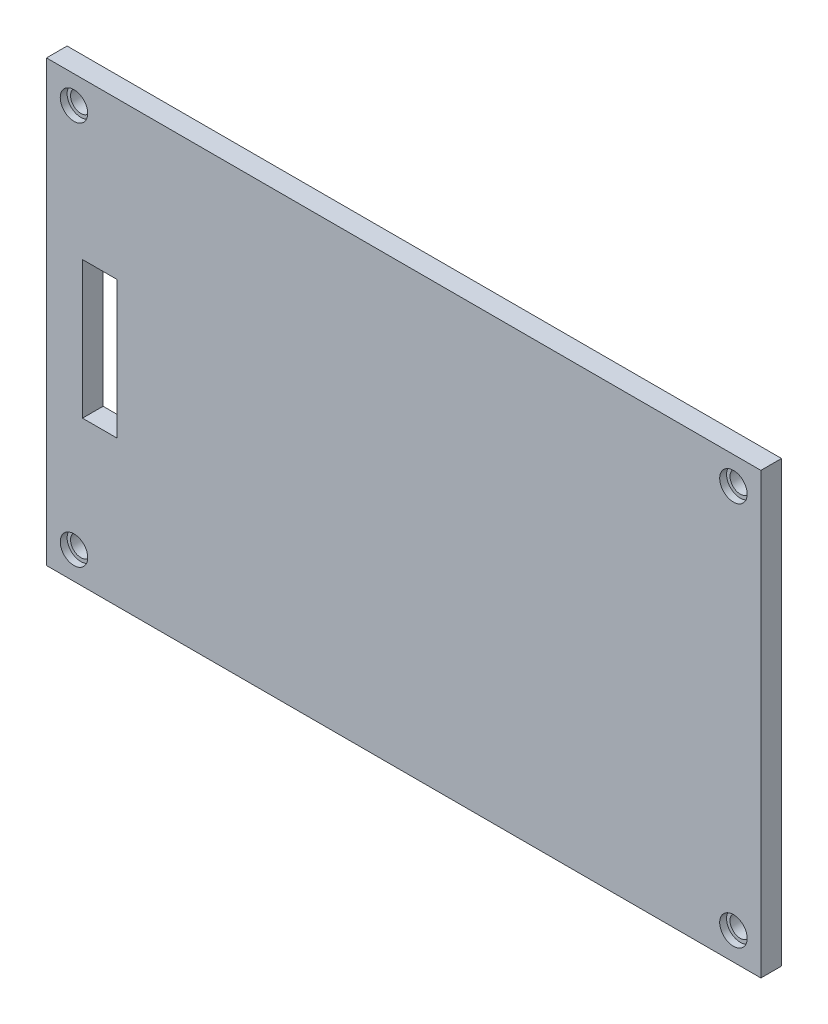
ISO-10303-21;
HEADER;
FILE_DESCRIPTION(('STEP AP214'),'2;1');
FILE_NAME('part.step','',(''),(''),'','','');
FILE_SCHEMA(('AUTOMOTIVE_DESIGN { 1 0 10303 214 1 1 1 1 }'));
ENDSEC;
DATA;
#1=APPLICATION_CONTEXT('core data for automotive mechanical design processes');
#2=APPLICATION_PROTOCOL_DEFINITION('international standard','automotive_design',2000,#1);
#3=PRODUCT_CONTEXT('',#1,'mechanical');
#4=PRODUCT('Part','Part','',(#3));
#5=PRODUCT_RELATED_PRODUCT_CATEGORY('part','',(#4));
#6=PRODUCT_DEFINITION_FORMATION('','',#4);
#7=PRODUCT_DEFINITION_CONTEXT('part definition',#1,'design');
#8=PRODUCT_DEFINITION('design','',#6,#7);
#9=PRODUCT_DEFINITION_SHAPE('','',#8);
#10=(LENGTH_UNIT() NAMED_UNIT(*) SI_UNIT(.MILLI.,.METRE.));
#11=(NAMED_UNIT(*) PLANE_ANGLE_UNIT() SI_UNIT($,.RADIAN.));
#12=(NAMED_UNIT(*) SI_UNIT($,.STERADIAN.) SOLID_ANGLE_UNIT());
#13=UNCERTAINTY_MEASURE_WITH_UNIT(LENGTH_MEASURE(1.E-05),#10,'distance_accuracy_value','');
#14=(GEOMETRIC_REPRESENTATION_CONTEXT(3) GLOBAL_UNCERTAINTY_ASSIGNED_CONTEXT((#13)) GLOBAL_UNIT_ASSIGNED_CONTEXT((#10,
#11,#12)) REPRESENTATION_CONTEXT('',''));
#15=CARTESIAN_POINT('',(0.,0.,0.));
#16=DIRECTION('',(0.,0.,1.));
#17=DIRECTION('',(1.,0.,0.));
#18=AXIS2_PLACEMENT_3D('',#15,#16,#17);
#19=CARTESIAN_POINT('',(48.,28.,0.));
#20=DIRECTION('',(0.,0.,1.));
#21=DIRECTION('',(1.,0.,0.));
#22=AXIS2_PLACEMENT_3D('',#19,#20,#21);
#23=CYLINDRICAL_SURFACE('',#22,1.5);
#24=CARTESIAN_POINT('',(48.,28.,0.));
#25=DIRECTION('',(0.,0.,1.));
#26=DIRECTION('',(-1.,0.,0.));
#27=AXIS2_PLACEMENT_3D('',#24,#25,#26);
#28=CIRCLE('',#27,1.5);
#29=CARTESIAN_POINT('',(46.5,28.,0.));
#30=VERTEX_POINT('',#29);
#31=EDGE_CURVE('E160',#30,#30,#28,.T.);
#32=ORIENTED_EDGE('',*,*,#31,.F.);
#33=EDGE_LOOP('',(#32));
#34=FACE_BOUND('',#33,.T.);
#35=CARTESIAN_POINT('',(48.,28.,2.));
#36=DIRECTION('',(0.,0.,1.));
#37=DIRECTION('',(1.,0.,0.));
#38=AXIS2_PLACEMENT_3D('',#35,#36,#37);
#39=CIRCLE('',#38,1.5);
#40=CARTESIAN_POINT('',(49.5,28.,2.));
#41=VERTEX_POINT('',#40);
#42=EDGE_CURVE('E220',#41,#41,#39,.F.);
#43=ORIENTED_EDGE('',*,*,#42,.F.);
#44=EDGE_LOOP('',(#43));
#45=FACE_BOUND('',#44,.T.);
#46=ADVANCED_FACE('F40',(#34,#45),#23,.F.);
#47=CARTESIAN_POINT('',(-48.,-28.,0.));
#48=DIRECTION('',(0.,0.,1.));
#49=DIRECTION('',(1.,0.,0.));
#50=AXIS2_PLACEMENT_3D('',#47,#48,#49);
#51=CYLINDRICAL_SURFACE('',#50,1.5);
#52=CARTESIAN_POINT('',(-48.,-28.,0.));
#53=DIRECTION('',(0.,0.,1.));
#54=DIRECTION('',(-1.,0.,0.));
#55=AXIS2_PLACEMENT_3D('',#52,#53,#54);
#56=CIRCLE('',#55,1.5);
#57=CARTESIAN_POINT('',(-49.5,-28.,0.));
#58=VERTEX_POINT('',#57);
#59=EDGE_CURVE('E154',#58,#58,#56,.T.);
#60=ORIENTED_EDGE('',*,*,#59,.F.);
#61=EDGE_LOOP('',(#60));
#62=FACE_BOUND('',#61,.T.);
#63=CARTESIAN_POINT('',(-48.,-28.,2.));
#64=DIRECTION('',(0.,0.,1.));
#65=DIRECTION('',(1.,0.,0.));
#66=AXIS2_PLACEMENT_3D('',#63,#64,#65);
#67=CIRCLE('',#66,1.5);
#68=CARTESIAN_POINT('',(-46.5,-28.,2.));
#69=VERTEX_POINT('',#68);
#70=EDGE_CURVE('E212',#69,#69,#67,.F.);
#71=ORIENTED_EDGE('',*,*,#70,.F.);
#72=EDGE_LOOP('',(#71));
#73=FACE_BOUND('',#72,.T.);
#74=ADVANCED_FACE('F249',(#62,#73),#51,.F.);
#75=CARTESIAN_POINT('',(-52.,-32.,3.));
#76=DIRECTION('',(1.,0.,0.));
#77=DIRECTION('',(0.,0.,-1.));
#78=AXIS2_PLACEMENT_3D('',#75,#76,#77);
#79=PLANE('',#78);
#80=DIRECTION('',(0.,-1.,0.));
#81=VECTOR('',#80,1.);
#82=CARTESIAN_POINT('',(-52.,-32.,0.));
#83=LINE('',#82,#81);
#84=CARTESIAN_POINT('',(-52.,32.,0.));
#85=VERTEX_POINT('',#84);
#86=CARTESIAN_POINT('',(-52.,-32.,0.));
#87=VERTEX_POINT('',#86);
#88=EDGE_CURVE('E175',#85,#87,#83,.T.);
#89=ORIENTED_EDGE('',*,*,#88,.T.);
#90=DIRECTION('',(0.,0.,-1.));
#91=VECTOR('',#90,1.);
#92=CARTESIAN_POINT('',(-52.,-32.,3.));
#93=LINE('',#92,#91);
#94=CARTESIAN_POINT('',(-52.,-32.,3.));
#95=VERTEX_POINT('',#94);
#96=EDGE_CURVE('E11',#95,#87,#93,.T.);
#97=ORIENTED_EDGE('',*,*,#96,.F.);
#98=DIRECTION('',(0.,-1.,0.));
#99=VECTOR('',#98,1.);
#100=CARTESIAN_POINT('',(-52.,-32.,3.));
#101=LINE('',#100,#99);
#102=CARTESIAN_POINT('',(-52.,32.,3.));
#103=VERTEX_POINT('',#102);
#104=EDGE_CURVE('E176',#103,#95,#101,.T.);
#105=ORIENTED_EDGE('',*,*,#104,.F.);
#106=DIRECTION('',(0.,0.,-1.));
#107=VECTOR('',#106,1.);
#108=CARTESIAN_POINT('',(-52.,32.,3.));
#109=LINE('',#108,#107);
#110=EDGE_CURVE('E190',#103,#85,#109,.T.);
#111=ORIENTED_EDGE('',*,*,#110,.T.);
#112=EDGE_LOOP('',(#89,#97,#105,#111));
#113=FACE_BOUND('',#112,.T.);
#114=ADVANCED_FACE('F42',(#113),#79,.F.);
#115=CARTESIAN_POINT('',(52.,-32.,3.));
#116=DIRECTION('',(0.,1.,0.));
#117=DIRECTION('',(-1.,0.,0.));
#118=AXIS2_PLACEMENT_3D('',#115,#116,#117);
#119=PLANE('',#118);
#120=DIRECTION('',(1.,0.,0.));
#121=VECTOR('',#120,1.);
#122=CARTESIAN_POINT('',(52.,-32.,0.));
#123=LINE('',#122,#121);
#124=CARTESIAN_POINT('',(52.,-32.,0.));
#125=VERTEX_POINT('',#124);
#126=EDGE_CURVE('E194',#87,#125,#123,.T.);
#127=ORIENTED_EDGE('',*,*,#126,.T.);
#128=DIRECTION('',(0.,0.,-1.));
#129=VECTOR('',#128,1.);
#130=CARTESIAN_POINT('',(52.,-32.,3.));
#131=LINE('',#130,#129);
#132=CARTESIAN_POINT('',(52.,-32.,3.));
#133=VERTEX_POINT('',#132);
#134=EDGE_CURVE('E50',#133,#125,#131,.T.);
#135=ORIENTED_EDGE('',*,*,#134,.F.);
#136=DIRECTION('',(1.,0.,0.));
#137=VECTOR('',#136,1.);
#138=CARTESIAN_POINT('',(52.,-32.,3.));
#139=LINE('',#138,#137);
#140=EDGE_CURVE('E180',#95,#133,#139,.T.);
#141=ORIENTED_EDGE('',*,*,#140,.F.);
#142=ORIENTED_EDGE('',*,*,#96,.T.);
#143=EDGE_LOOP('',(#127,#135,#141,#142));
#144=FACE_BOUND('',#143,.T.);
#145=ADVANCED_FACE('F281',(#144),#119,.F.);
#146=CARTESIAN_POINT('',(52.,-32.,3.));
#147=DIRECTION('',(-1.,0.,0.));
#148=DIRECTION('',(0.,0.,1.));
#149=AXIS2_PLACEMENT_3D('',#146,#147,#148);
#150=PLANE('',#149);
#151=DIRECTION('',(0.,1.,0.));
#152=VECTOR('',#151,1.);
#153=CARTESIAN_POINT('',(52.,-32.,0.));
#154=LINE('',#153,#152);
#155=CARTESIAN_POINT('',(52.,32.,0.));
#156=VERTEX_POINT('',#155);
#157=EDGE_CURVE('E197',#125,#156,#154,.T.);
#158=ORIENTED_EDGE('',*,*,#157,.T.);
#159=DIRECTION('',(0.,0.,-1.));
#160=VECTOR('',#159,1.);
#161=CARTESIAN_POINT('',(52.,32.,3.));
#162=LINE('',#161,#160);
#163=CARTESIAN_POINT('',(52.,32.,3.));
#164=VERTEX_POINT('',#163);
#165=EDGE_CURVE('E205',#164,#156,#162,.T.);
#166=ORIENTED_EDGE('',*,*,#165,.F.);
#167=DIRECTION('',(0.,1.,0.));
#168=VECTOR('',#167,1.);
#169=CARTESIAN_POINT('',(52.,-32.,3.));
#170=LINE('',#169,#168);
#171=EDGE_CURVE('E184',#133,#164,#170,.T.);
#172=ORIENTED_EDGE('',*,*,#171,.F.);
#173=ORIENTED_EDGE('',*,*,#134,.T.);
#174=EDGE_LOOP('',(#158,#166,#172,#173));
#175=FACE_BOUND('',#174,.T.);
#176=ADVANCED_FACE('F278',(#175),#150,.F.);
#177=CARTESIAN_POINT('',(52.,32.,3.));
#178=DIRECTION('',(0.,-1.,0.));
#179=DIRECTION('',(1.,0.,0.));
#180=AXIS2_PLACEMENT_3D('',#177,#178,#179);
#181=PLANE('',#180);
#182=DIRECTION('',(-1.,0.,0.));
#183=VECTOR('',#182,1.);
#184=CARTESIAN_POINT('',(52.,32.,0.));
#185=LINE('',#184,#183);
#186=EDGE_CURVE('E181',#156,#85,#185,.T.);
#187=ORIENTED_EDGE('',*,*,#186,.T.);
#188=ORIENTED_EDGE('',*,*,#110,.F.);
#189=DIRECTION('',(-1.,0.,0.));
#190=VECTOR('',#189,1.);
#191=CARTESIAN_POINT('',(52.,32.,3.));
#192=LINE('',#191,#190);
#193=EDGE_CURVE('E187',#164,#103,#192,.T.);
#194=ORIENTED_EDGE('',*,*,#193,.F.);
#195=ORIENTED_EDGE('',*,*,#165,.T.);
#196=EDGE_LOOP('',(#187,#188,#194,#195));
#197=FACE_BOUND('',#196,.T.);
#198=ADVANCED_FACE('F271',(#197),#181,.F.);
#199=CARTESIAN_POINT('',(0.,0.,3.));
#200=DIRECTION('',(0.,0.,1.));
#201=DIRECTION('',(1.,0.,0.));
#202=AXIS2_PLACEMENT_3D('',#199,#200,#201);
#203=PLANE('',#202);
#204=CARTESIAN_POINT('',(48.,-28.,3.));
#205=DIRECTION('',(0.,0.,1.));
#206=DIRECTION('',(-1.,0.,0.));
#207=AXIS2_PLACEMENT_3D('',#204,#205,#206);
#208=CIRCLE('',#207,2.);
#209=CARTESIAN_POINT('',(46.,-28.,3.));
#210=VERTEX_POINT('',#209);
#211=EDGE_CURVE('E474',#210,#210,#208,.T.);
#212=ORIENTED_EDGE('',*,*,#211,.F.);
#213=EDGE_LOOP('',(#212));
#214=FACE_BOUND('',#213,.T.);
#215=CARTESIAN_POINT('',(-48.,-28.,3.));
#216=DIRECTION('',(0.,0.,1.));
#217=DIRECTION('',(1.,0.,0.));
#218=AXIS2_PLACEMENT_3D('',#215,#216,#217);
#219=CIRCLE('',#218,2.);
#220=CARTESIAN_POINT('',(-46.,-28.,3.));
#221=VERTEX_POINT('',#220);
#222=EDGE_CURVE('E482',#221,#221,#219,.T.);
#223=ORIENTED_EDGE('',*,*,#222,.F.);
#224=EDGE_LOOP('',(#223));
#225=FACE_BOUND('',#224,.T.);
#226=CARTESIAN_POINT('',(-48.,28.,3.));
#227=DIRECTION('',(0.,0.,1.));
#228=DIRECTION('',(-1.,0.,0.));
#229=AXIS2_PLACEMENT_3D('',#226,#227,#228);
#230=CIRCLE('',#229,2.);
#231=CARTESIAN_POINT('',(-50.,28.,3.));
#232=VERTEX_POINT('',#231);
#233=EDGE_CURVE('E490',#232,#232,#230,.T.);
#234=ORIENTED_EDGE('',*,*,#233,.F.);
#235=EDGE_LOOP('',(#234));
#236=FACE_BOUND('',#235,.T.);
#237=CARTESIAN_POINT('',(48.,28.,3.));
#238=DIRECTION('',(0.,0.,1.));
#239=DIRECTION('',(1.,0.,0.));
#240=AXIS2_PLACEMENT_3D('',#237,#238,#239);
#241=CIRCLE('',#240,2.);
#242=CARTESIAN_POINT('',(50.,28.,3.));
#243=VERTEX_POINT('',#242);
#244=EDGE_CURVE('E136',#243,#243,#241,.T.);
#245=ORIENTED_EDGE('',*,*,#244,.F.);
#246=EDGE_LOOP('',(#245));
#247=FACE_BOUND('',#246,.T.);
#248=DIRECTION('',(0.,1.,0.));
#249=VECTOR('',#248,1.);
#250=CARTESIAN_POINT('',(-46.7600568695519,-10.8000147076427,3.));
#251=LINE('',#250,#249);
#252=CARTESIAN_POINT('',(-46.7600568695519,-10.8000147076427,3.));
#253=VERTEX_POINT('',#252);
#254=CARTESIAN_POINT('',(-46.7600568695519,9.19998529235728,3.));
#255=VERTEX_POINT('',#254);
#256=EDGE_CURVE('E110',#253,#255,#251,.T.);
#257=ORIENTED_EDGE('',*,*,#256,.T.);
#258=DIRECTION('',(1.,0.,0.));
#259=VECTOR('',#258,1.);
#260=CARTESIAN_POINT('',(-41.7600568695519,9.19998529235728,3.));
#261=LINE('',#260,#259);
#262=CARTESIAN_POINT('',(-41.7600568695519,9.19998529235728,3.));
#263=VERTEX_POINT('',#262);
#264=EDGE_CURVE('E120',#255,#263,#261,.T.);
#265=ORIENTED_EDGE('',*,*,#264,.T.);
#266=DIRECTION('',(0.,-1.,0.));
#267=VECTOR('',#266,1.);
#268=CARTESIAN_POINT('',(-41.7600568695519,-10.8000147076427,3.));
#269=LINE('',#268,#267);
#270=CARTESIAN_POINT('',(-41.7600568695519,-10.8000147076427,3.));
#271=VERTEX_POINT('',#270);
#272=EDGE_CURVE('E58',#263,#271,#269,.T.);
#273=ORIENTED_EDGE('',*,*,#272,.T.);
#274=DIRECTION('',(-1.,0.,0.));
#275=VECTOR('',#274,1.);
#276=CARTESIAN_POINT('',(-41.7600568695519,-10.8000147076427,3.));
#277=LINE('',#276,#275);
#278=EDGE_CURVE('E117',#271,#253,#277,.T.);
#279=ORIENTED_EDGE('',*,*,#278,.T.);
#280=EDGE_LOOP('',(#257,#265,#273,#279));
#281=FACE_BOUND('',#280,.T.);
#282=ORIENTED_EDGE('',*,*,#104,.T.);
#283=ORIENTED_EDGE('',*,*,#140,.T.);
#284=ORIENTED_EDGE('',*,*,#171,.T.);
#285=ORIENTED_EDGE('',*,*,#193,.T.);
#286=EDGE_LOOP('',(#282,#283,#284,#285));
#287=FACE_BOUND('',#286,.T.);
#288=ADVANCED_FACE('F125',(#214,#225,#236,#247,#281,#287),#203,.T.);
#289=CARTESIAN_POINT('',(0.,0.,0.));
#290=DIRECTION('',(0.,0.,1.));
#291=DIRECTION('',(1.,0.,0.));
#292=AXIS2_PLACEMENT_3D('',#289,#290,#291);
#293=PLANE('',#292);
#294=DIRECTION('',(1.,0.,0.));
#295=VECTOR('',#294,1.);
#296=CARTESIAN_POINT('',(-41.7600568695519,9.19998529235728,0.));
#297=LINE('',#296,#295);
#298=CARTESIAN_POINT('',(-46.7600568695519,9.19998529235728,0.));
#299=VERTEX_POINT('',#298);
#300=CARTESIAN_POINT('',(-41.7600568695519,9.19998529235728,0.));
#301=VERTEX_POINT('',#300);
#302=EDGE_CURVE('E145',#299,#301,#297,.T.);
#303=ORIENTED_EDGE('',*,*,#302,.F.);
#304=DIRECTION('',(0.,1.,0.));
#305=VECTOR('',#304,1.);
#306=CARTESIAN_POINT('',(-46.7600568695519,-10.8000147076427,0.));
#307=LINE('',#306,#305);
#308=CARTESIAN_POINT('',(-46.7600568695519,-10.8000147076427,0.));
#309=VERTEX_POINT('',#308);
#310=EDGE_CURVE('E66',#309,#299,#307,.T.);
#311=ORIENTED_EDGE('',*,*,#310,.F.);
#312=DIRECTION('',(-1.,0.,0.));
#313=VECTOR('',#312,1.);
#314=CARTESIAN_POINT('',(-41.7600568695519,-10.8000147076427,0.));
#315=LINE('',#314,#313);
#316=CARTESIAN_POINT('',(-41.7600568695519,-10.8000147076427,0.));
#317=VERTEX_POINT('',#316);
#318=EDGE_CURVE('E129',#317,#309,#315,.T.);
#319=ORIENTED_EDGE('',*,*,#318,.F.);
#320=DIRECTION('',(0.,-1.,0.));
#321=VECTOR('',#320,1.);
#322=CARTESIAN_POINT('',(-41.7600568695519,-10.8000147076427,0.));
#323=LINE('',#322,#321);
#324=EDGE_CURVE('E133',#301,#317,#323,.T.);
#325=ORIENTED_EDGE('',*,*,#324,.F.);
#326=EDGE_LOOP('',(#303,#311,#319,#325));
#327=FACE_BOUND('',#326,.T.);
#328=ORIENTED_EDGE('',*,*,#59,.T.);
#329=EDGE_LOOP('',(#328));
#330=FACE_BOUND('',#329,.T.);
#331=CARTESIAN_POINT('',(48.,-28.,0.));
#332=DIRECTION('',(0.,0.,1.));
#333=DIRECTION('',(1.,0.,0.));
#334=AXIS2_PLACEMENT_3D('',#331,#332,#333);
#335=CIRCLE('',#334,1.5);
#336=CARTESIAN_POINT('',(49.5,-28.,0.));
#337=VERTEX_POINT('',#336);
#338=EDGE_CURVE('E165',#337,#337,#335,.T.);
#339=ORIENTED_EDGE('',*,*,#338,.T.);
#340=EDGE_LOOP('',(#339));
#341=FACE_BOUND('',#340,.T.);
#342=ORIENTED_EDGE('',*,*,#31,.T.);
#343=EDGE_LOOP('',(#342));
#344=FACE_BOUND('',#343,.T.);
#345=CARTESIAN_POINT('',(-48.,28.,0.));
#346=DIRECTION('',(0.,0.,1.));
#347=DIRECTION('',(1.,0.,0.));
#348=AXIS2_PLACEMENT_3D('',#345,#346,#347);
#349=CIRCLE('',#348,1.5);
#350=CARTESIAN_POINT('',(-46.5,28.,0.));
#351=VERTEX_POINT('',#350);
#352=EDGE_CURVE('E164',#351,#351,#349,.T.);
#353=ORIENTED_EDGE('',*,*,#352,.T.);
#354=EDGE_LOOP('',(#353));
#355=FACE_BOUND('',#354,.T.);
#356=ORIENTED_EDGE('',*,*,#88,.F.);
#357=ORIENTED_EDGE('',*,*,#186,.F.);
#358=ORIENTED_EDGE('',*,*,#157,.F.);
#359=ORIENTED_EDGE('',*,*,#126,.F.);
#360=EDGE_LOOP('',(#356,#357,#358,#359));
#361=FACE_BOUND('',#360,.T.);
#362=ADVANCED_FACE('F268',(#327,#330,#341,#344,#355,#361),#293,.F.);
#363=CARTESIAN_POINT('',(-48.,28.,0.));
#364=DIRECTION('',(0.,0.,1.));
#365=DIRECTION('',(1.,0.,0.));
#366=AXIS2_PLACEMENT_3D('',#363,#364,#365);
#367=CYLINDRICAL_SURFACE('',#366,1.5);
#368=CARTESIAN_POINT('',(-48.,28.,2.));
#369=DIRECTION('',(0.,0.,-1.));
#370=DIRECTION('',(-1.,0.,0.));
#371=AXIS2_PLACEMENT_3D('',#368,#369,#370);
#372=CIRCLE('',#371,1.5);
#373=CARTESIAN_POINT('',(-49.5,28.,2.));
#374=VERTEX_POINT('',#373);
#375=EDGE_CURVE('E44',#374,#374,#372,.F.);
#376=ORIENTED_EDGE('',*,*,#375,.T.);
#377=EDGE_LOOP('',(#376));
#378=FACE_BOUND('',#377,.T.);
#379=ORIENTED_EDGE('',*,*,#352,.F.);
#380=EDGE_LOOP('',(#379));
#381=FACE_BOUND('',#380,.T.);
#382=ADVANCED_FACE('F229',(#378,#381),#367,.F.);
#383=CARTESIAN_POINT('',(48.,-28.,0.));
#384=DIRECTION('',(0.,0.,1.));
#385=DIRECTION('',(1.,0.,0.));
#386=AXIS2_PLACEMENT_3D('',#383,#384,#385);
#387=CYLINDRICAL_SURFACE('',#386,1.5);
#388=CARTESIAN_POINT('',(48.,-28.,2.));
#389=DIRECTION('',(0.,0.,-1.));
#390=DIRECTION('',(-1.,0.,0.));
#391=AXIS2_PLACEMENT_3D('',#388,#389,#390);
#392=CIRCLE('',#391,1.5);
#393=CARTESIAN_POINT('',(46.5,-28.,2.));
#394=VERTEX_POINT('',#393);
#395=EDGE_CURVE('E216',#394,#394,#392,.F.);
#396=ORIENTED_EDGE('',*,*,#395,.T.);
#397=EDGE_LOOP('',(#396));
#398=FACE_BOUND('',#397,.T.);
#399=ORIENTED_EDGE('',*,*,#338,.F.);
#400=EDGE_LOOP('',(#399));
#401=FACE_BOUND('',#400,.T.);
#402=ADVANCED_FACE('F262',(#398,#401),#387,.F.);
#403=CARTESIAN_POINT('',(-46.7600568695519,-10.8000147076427,3.));
#404=DIRECTION('',(-1.,0.,0.));
#405=DIRECTION('',(0.,0.,1.));
#406=AXIS2_PLACEMENT_3D('',#403,#404,#405);
#407=PLANE('',#406);
#408=ORIENTED_EDGE('',*,*,#310,.T.);
#409=DIRECTION('',(0.,0.,-1.));
#410=VECTOR('',#409,1.);
#411=CARTESIAN_POINT('',(-46.7600568695519,9.19998529235728,3.));
#412=LINE('',#411,#410);
#413=EDGE_CURVE('E106',#255,#299,#412,.T.);
#414=ORIENTED_EDGE('',*,*,#413,.F.);
#415=ORIENTED_EDGE('',*,*,#256,.F.);
#416=DIRECTION('',(0.,0.,-1.));
#417=VECTOR('',#416,1.);
#418=CARTESIAN_POINT('',(-46.7600568695519,-10.8000147076427,3.));
#419=LINE('',#418,#417);
#420=EDGE_CURVE('E151',#253,#309,#419,.T.);
#421=ORIENTED_EDGE('',*,*,#420,.T.);
#422=EDGE_LOOP('',(#408,#414,#415,#421));
#423=FACE_BOUND('',#422,.T.);
#424=ADVANCED_FACE('F108',(#423),#407,.F.);
#425=CARTESIAN_POINT('',(-41.7600568695519,-10.8000147076427,3.));
#426=DIRECTION('',(0.,-1.,0.));
#427=DIRECTION('',(0.,0.,-1.));
#428=AXIS2_PLACEMENT_3D('',#425,#426,#427);
#429=PLANE('',#428);
#430=ORIENTED_EDGE('',*,*,#318,.T.);
#431=ORIENTED_EDGE('',*,*,#420,.F.);
#432=ORIENTED_EDGE('',*,*,#278,.F.);
#433=DIRECTION('',(0.,0.,-1.));
#434=VECTOR('',#433,1.);
#435=CARTESIAN_POINT('',(-41.7600568695519,-10.8000147076427,3.));
#436=LINE('',#435,#434);
#437=EDGE_CURVE('E155',#271,#317,#436,.T.);
#438=ORIENTED_EDGE('',*,*,#437,.T.);
#439=EDGE_LOOP('',(#430,#431,#432,#438));
#440=FACE_BOUND('',#439,.T.);
#441=ADVANCED_FACE('F404',(#440),#429,.F.);
#442=CARTESIAN_POINT('',(-41.7600568695519,-10.8000147076427,3.));
#443=DIRECTION('',(1.,0.,0.));
#444=DIRECTION('',(0.,0.,-1.));
#445=AXIS2_PLACEMENT_3D('',#442,#443,#444);
#446=PLANE('',#445);
#447=ORIENTED_EDGE('',*,*,#324,.T.);
#448=ORIENTED_EDGE('',*,*,#437,.F.);
#449=ORIENTED_EDGE('',*,*,#272,.F.);
#450=DIRECTION('',(0.,0.,-1.));
#451=VECTOR('',#450,1.);
#452=CARTESIAN_POINT('',(-41.7600568695519,9.19998529235728,3.));
#453=LINE('',#452,#451);
#454=EDGE_CURVE('E116',#263,#301,#453,.T.);
#455=ORIENTED_EDGE('',*,*,#454,.T.);
#456=EDGE_LOOP('',(#447,#448,#449,#455));
#457=FACE_BOUND('',#456,.T.);
#458=ADVANCED_FACE('F407',(#457),#446,.F.);
#459=CARTESIAN_POINT('',(-41.7600568695519,9.19998529235728,3.));
#460=DIRECTION('',(0.,1.,0.));
#461=DIRECTION('',(0.,0.,1.));
#462=AXIS2_PLACEMENT_3D('',#459,#460,#461);
#463=PLANE('',#462);
#464=ORIENTED_EDGE('',*,*,#302,.T.);
#465=ORIENTED_EDGE('',*,*,#454,.F.);
#466=ORIENTED_EDGE('',*,*,#264,.F.);
#467=ORIENTED_EDGE('',*,*,#413,.T.);
#468=EDGE_LOOP('',(#464,#465,#466,#467));
#469=FACE_BOUND('',#468,.T.);
#470=ADVANCED_FACE('F121',(#469),#463,.F.);
#471=CARTESIAN_POINT('',(-48.,-28.,2.));
#472=DIRECTION('',(0.,0.,1.));
#473=DIRECTION('',(1.,0.,0.));
#474=AXIS2_PLACEMENT_3D('',#471,#472,#473);
#475=PLANE('',#474);
#476=CARTESIAN_POINT('',(-48.,-28.,2.));
#477=DIRECTION('',(0.,0.,1.));
#478=DIRECTION('',(1.,0.,0.));
#479=AXIS2_PLACEMENT_3D('',#476,#477,#478);
#480=CIRCLE('',#479,2.);
#481=CARTESIAN_POINT('',(-46.,-28.,2.));
#482=VERTEX_POINT('',#481);
#483=EDGE_CURVE('E486',#482,#482,#480,.T.);
#484=ORIENTED_EDGE('',*,*,#483,.T.);
#485=EDGE_LOOP('',(#484));
#486=FACE_BOUND('',#485,.T.);
#487=ORIENTED_EDGE('',*,*,#70,.T.);
#488=EDGE_LOOP('',(#487));
#489=FACE_BOUND('',#488,.T.);
#490=ADVANCED_FACE('F337',(#486,#489),#475,.T.);
#491=CARTESIAN_POINT('',(-48.,-28.,2.));
#492=DIRECTION('',(0.,0.,1.));
#493=DIRECTION('',(1.,0.,0.));
#494=AXIS2_PLACEMENT_3D('',#491,#492,#493);
#495=CYLINDRICAL_SURFACE('',#494,2.);
#496=ORIENTED_EDGE('',*,*,#483,.F.);
#497=EDGE_LOOP('',(#496));
#498=FACE_BOUND('',#497,.T.);
#499=ORIENTED_EDGE('',*,*,#222,.T.);
#500=EDGE_LOOP('',(#499));
#501=FACE_BOUND('',#500,.T.);
#502=ADVANCED_FACE('F342',(#498,#501),#495,.F.);
#503=CARTESIAN_POINT('',(48.,-28.,2.));
#504=DIRECTION('',(0.,0.,-1.));
#505=DIRECTION('',(-1.,0.,0.));
#506=AXIS2_PLACEMENT_3D('',#503,#504,#505);
#507=PLANE('',#506);
#508=CARTESIAN_POINT('',(48.,-28.,2.));
#509=DIRECTION('',(0.,0.,1.));
#510=DIRECTION('',(-1.,0.,0.));
#511=AXIS2_PLACEMENT_3D('',#508,#509,#510);
#512=CIRCLE('',#511,2.);
#513=CARTESIAN_POINT('',(46.,-28.,2.));
#514=VERTEX_POINT('',#513);
#515=EDGE_CURVE('E478',#514,#514,#512,.T.);
#516=ORIENTED_EDGE('',*,*,#515,.T.);
#517=EDGE_LOOP('',(#516));
#518=FACE_BOUND('',#517,.T.);
#519=ORIENTED_EDGE('',*,*,#395,.F.);
#520=EDGE_LOOP('',(#519));
#521=FACE_BOUND('',#520,.T.);
#522=ADVANCED_FACE('F353',(#518,#521),#507,.F.);
#523=CARTESIAN_POINT('',(48.,-28.,2.));
#524=DIRECTION('',(0.,0.,1.));
#525=DIRECTION('',(1.,0.,0.));
#526=AXIS2_PLACEMENT_3D('',#523,#524,#525);
#527=CYLINDRICAL_SURFACE('',#526,2.);
#528=ORIENTED_EDGE('',*,*,#515,.F.);
#529=EDGE_LOOP('',(#528));
#530=FACE_BOUND('',#529,.T.);
#531=ORIENTED_EDGE('',*,*,#211,.T.);
#532=EDGE_LOOP('',(#531));
#533=FACE_BOUND('',#532,.T.);
#534=ADVANCED_FACE('F363',(#530,#533),#527,.F.);
#535=CARTESIAN_POINT('',(48.,28.,2.));
#536=DIRECTION('',(0.,0.,1.));
#537=DIRECTION('',(1.,0.,0.));
#538=AXIS2_PLACEMENT_3D('',#535,#536,#537);
#539=PLANE('',#538);
#540=CARTESIAN_POINT('',(48.,28.,2.));
#541=DIRECTION('',(0.,0.,1.));
#542=DIRECTION('',(1.,0.,0.));
#543=AXIS2_PLACEMENT_3D('',#540,#541,#542);
#544=CIRCLE('',#543,2.);
#545=CARTESIAN_POINT('',(50.,28.,2.));
#546=VERTEX_POINT('',#545);
#547=EDGE_CURVE('E217',#546,#546,#544,.T.);
#548=ORIENTED_EDGE('',*,*,#547,.T.);
#549=EDGE_LOOP('',(#548));
#550=FACE_BOUND('',#549,.T.);
#551=ORIENTED_EDGE('',*,*,#42,.T.);
#552=EDGE_LOOP('',(#551));
#553=FACE_BOUND('',#552,.T.);
#554=ADVANCED_FACE('F244',(#550,#553),#539,.T.);
#555=CARTESIAN_POINT('',(48.,28.,2.));
#556=DIRECTION('',(0.,0.,1.));
#557=DIRECTION('',(1.,0.,0.));
#558=AXIS2_PLACEMENT_3D('',#555,#556,#557);
#559=CYLINDRICAL_SURFACE('',#558,2.);
#560=ORIENTED_EDGE('',*,*,#547,.F.);
#561=EDGE_LOOP('',(#560));
#562=FACE_BOUND('',#561,.T.);
#563=ORIENTED_EDGE('',*,*,#244,.T.);
#564=EDGE_LOOP('',(#563));
#565=FACE_BOUND('',#564,.T.);
#566=ADVANCED_FACE('F235',(#562,#565),#559,.F.);
#567=CARTESIAN_POINT('',(-48.,28.,2.));
#568=DIRECTION('',(0.,0.,-1.));
#569=DIRECTION('',(-1.,0.,0.));
#570=AXIS2_PLACEMENT_3D('',#567,#568,#569);
#571=PLANE('',#570);
#572=CARTESIAN_POINT('',(-48.,28.,2.));
#573=DIRECTION('',(0.,0.,1.));
#574=DIRECTION('',(-1.,0.,0.));
#575=AXIS2_PLACEMENT_3D('',#572,#573,#574);
#576=CIRCLE('',#575,2.);
#577=CARTESIAN_POINT('',(-50.,28.,2.));
#578=VERTEX_POINT('',#577);
#579=EDGE_CURVE('E472',#578,#578,#576,.T.);
#580=ORIENTED_EDGE('',*,*,#579,.T.);
#581=EDGE_LOOP('',(#580));
#582=FACE_BOUND('',#581,.T.);
#583=ORIENTED_EDGE('',*,*,#375,.F.);
#584=EDGE_LOOP('',(#583));
#585=FACE_BOUND('',#584,.T.);
#586=ADVANCED_FACE('F232',(#582,#585),#571,.F.);
#587=CARTESIAN_POINT('',(-48.,28.,2.));
#588=DIRECTION('',(0.,0.,1.));
#589=DIRECTION('',(1.,0.,0.));
#590=AXIS2_PLACEMENT_3D('',#587,#588,#589);
#591=CYLINDRICAL_SURFACE('',#590,2.);
#592=ORIENTED_EDGE('',*,*,#579,.F.);
#593=EDGE_LOOP('',(#592));
#594=FACE_BOUND('',#593,.T.);
#595=ORIENTED_EDGE('',*,*,#233,.T.);
#596=EDGE_LOOP('',(#595));
#597=FACE_BOUND('',#596,.T.);
#598=ADVANCED_FACE('F234',(#594,#597),#591,.F.);
#599=CLOSED_SHELL('',(#46,#74,#114,#145,#176,#198,#288,#362,#382,#402,#424,#441,#458,#470,#490,
#502,#522,#534,#554,#566,#586,#598));
#600=MANIFOLD_SOLID_BREP('B2',#599);
#601=ADVANCED_BREP_SHAPE_REPRESENTATION('',(#18,#600),#14);
#602=SHAPE_DEFINITION_REPRESENTATION(#9,#601);
ENDSEC;
END-ISO-10303-21;
